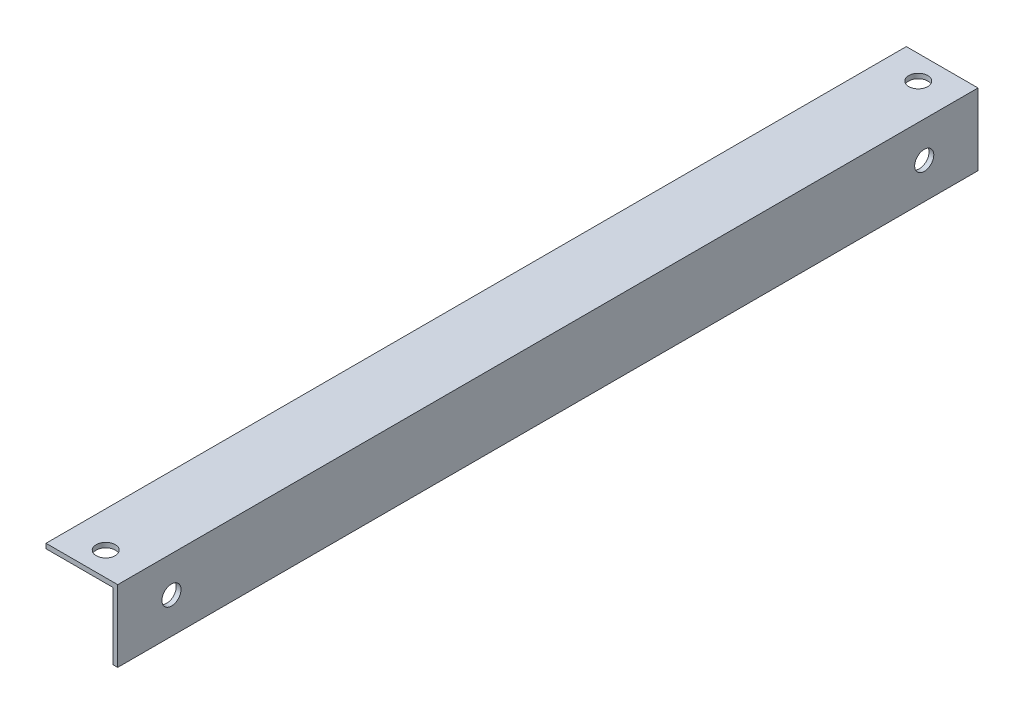
ISO-10303-21;
HEADER;
FILE_DESCRIPTION(('STEP AP214'),'2;1');
FILE_NAME('part.step','',(''),(''),'','','');
FILE_SCHEMA(('AUTOMOTIVE_DESIGN { 1 0 10303 214 1 1 1 1 }'));
ENDSEC;
DATA;
#1=APPLICATION_CONTEXT('core data for automotive mechanical design processes');
#2=APPLICATION_PROTOCOL_DEFINITION('international standard','automotive_design',2000,#1);
#3=PRODUCT_CONTEXT('',#1,'mechanical');
#4=PRODUCT('Part','Part','',(#3));
#5=PRODUCT_RELATED_PRODUCT_CATEGORY('part','',(#4));
#6=PRODUCT_DEFINITION_FORMATION('','',#4);
#7=PRODUCT_DEFINITION_CONTEXT('part definition',#1,'design');
#8=PRODUCT_DEFINITION('design','',#6,#7);
#9=PRODUCT_DEFINITION_SHAPE('','',#8);
#10=(LENGTH_UNIT() NAMED_UNIT(*) SI_UNIT(.MILLI.,.METRE.));
#11=(NAMED_UNIT(*) PLANE_ANGLE_UNIT() SI_UNIT($,.RADIAN.));
#12=(NAMED_UNIT(*) SI_UNIT($,.STERADIAN.) SOLID_ANGLE_UNIT());
#13=UNCERTAINTY_MEASURE_WITH_UNIT(LENGTH_MEASURE(1.E-05),#10,'distance_accuracy_value','');
#14=(GEOMETRIC_REPRESENTATION_CONTEXT(3) GLOBAL_UNCERTAINTY_ASSIGNED_CONTEXT((#13)) GLOBAL_UNIT_ASSIGNED_CONTEXT((#10,
#11,#12)) REPRESENTATION_CONTEXT('',''));
#15=CARTESIAN_POINT('',(0.,0.,0.));
#16=DIRECTION('',(0.,0.,1.));
#17=DIRECTION('',(1.,0.,0.));
#18=AXIS2_PLACEMENT_3D('',#15,#16,#17);
#19=CARTESIAN_POINT('',(0.,0.,180.));
#20=DIRECTION('',(-1.,0.,0.));
#21=DIRECTION('',(0.,-1.,0.));
#22=AXIS2_PLACEMENT_3D('',#19,#20,#21);
#23=PLANE('',#22);
#24=DIRECTION('',(0.,1.,0.));
#25=VECTOR('',#24,1.);
#26=CARTESIAN_POINT('',(0.,0.,-180.));
#27=LINE('',#26,#25);
#28=CARTESIAN_POINT('',(0.,-30.,-180.));
#29=VERTEX_POINT('',#28);
#30=CARTESIAN_POINT('',(0.,0.,-180.));
#31=VERTEX_POINT('',#30);
#32=EDGE_CURVE('E121',#29,#31,#27,.T.);
#33=ORIENTED_EDGE('',*,*,#32,.T.);
#34=DIRECTION('',(0.,0.,-1.));
#35=VECTOR('',#34,1.);
#36=CARTESIAN_POINT('',(0.,0.,180.));
#37=LINE('',#36,#35);
#38=CARTESIAN_POINT('',(0.,0.,180.));
#39=VERTEX_POINT('',#38);
#40=EDGE_CURVE('E11',#39,#31,#37,.T.);
#41=ORIENTED_EDGE('',*,*,#40,.F.);
#42=DIRECTION('',(0.,1.,0.));
#43=VECTOR('',#42,1.);
#44=CARTESIAN_POINT('',(0.,0.,180.));
#45=LINE('',#44,#43);
#46=CARTESIAN_POINT('',(0.,-30.,180.));
#47=VERTEX_POINT('',#46);
#48=EDGE_CURVE('E132',#47,#39,#45,.T.);
#49=ORIENTED_EDGE('',*,*,#48,.F.);
#50=DIRECTION('',(0.,0.,-1.));
#51=VECTOR('',#50,1.);
#52=CARTESIAN_POINT('',(0.,-30.,180.));
#53=LINE('',#52,#51);
#54=EDGE_CURVE('E117',#47,#29,#53,.T.);
#55=ORIENTED_EDGE('',*,*,#54,.T.);
#56=EDGE_LOOP('',(#33,#41,#49,#55));
#57=FACE_BOUND('',#56,.T.);
#58=CARTESIAN_POINT('',(0.,-15.,-157.5));
#59=DIRECTION('',(1.,0.,0.));
#60=DIRECTION('',(0.,1.,0.));
#61=AXIS2_PLACEMENT_3D('',#58,#59,#60);
#62=CIRCLE('',#61,3.99999999999999);
#63=CARTESIAN_POINT('',(0.,-11.,-157.5));
#64=VERTEX_POINT('',#63);
#65=EDGE_CURVE('E265',#64,#64,#62,.T.);
#66=ORIENTED_EDGE('',*,*,#65,.F.);
#67=EDGE_LOOP('',(#66));
#68=FACE_BOUND('',#67,.T.);
#69=CARTESIAN_POINT('',(0.,-15.,157.5));
#70=DIRECTION('',(-1.,0.,0.));
#71=DIRECTION('',(0.,1.,0.));
#72=AXIS2_PLACEMENT_3D('',#69,#70,#71);
#73=CIRCLE('',#72,3.99999999999999);
#74=CARTESIAN_POINT('',(0.,-11.,157.5));
#75=VERTEX_POINT('',#74);
#76=EDGE_CURVE('E253',#75,#75,#73,.T.);
#77=ORIENTED_EDGE('',*,*,#76,.T.);
#78=EDGE_LOOP('',(#77));
#79=FACE_BOUND('',#78,.T.);
#80=ADVANCED_FACE('F35',(#57,#68,#79),#23,.F.);
#81=CARTESIAN_POINT('',(-2.,-2.,180.));
#82=DIRECTION('',(1.,0.,0.));
#83=DIRECTION('',(0.,0.,-1.));
#84=AXIS2_PLACEMENT_3D('',#81,#82,#83);
#85=PLANE('',#84);
#86=DIRECTION('',(0.,-1.,0.));
#87=VECTOR('',#86,1.);
#88=CARTESIAN_POINT('',(-2.,-2.,-180.));
#89=LINE('',#88,#87);
#90=CARTESIAN_POINT('',(-2.,-2.,-180.));
#91=VERTEX_POINT('',#90);
#92=CARTESIAN_POINT('',(-2.,-30.,-180.));
#93=VERTEX_POINT('',#92);
#94=EDGE_CURVE('E74',#91,#93,#89,.T.);
#95=ORIENTED_EDGE('',*,*,#94,.T.);
#96=DIRECTION('',(0.,0.,-1.));
#97=VECTOR('',#96,1.);
#98=CARTESIAN_POINT('',(-2.,-30.,180.));
#99=LINE('',#98,#97);
#100=CARTESIAN_POINT('',(-2.,-30.,180.));
#101=VERTEX_POINT('',#100);
#102=EDGE_CURVE('E112',#101,#93,#99,.T.);
#103=ORIENTED_EDGE('',*,*,#102,.F.);
#104=DIRECTION('',(0.,-1.,0.));
#105=VECTOR('',#104,1.);
#106=CARTESIAN_POINT('',(-2.,-2.,180.));
#107=LINE('',#106,#105);
#108=CARTESIAN_POINT('',(-2.,-2.,180.));
#109=VERTEX_POINT('',#108);
#110=EDGE_CURVE('E99',#109,#101,#107,.T.);
#111=ORIENTED_EDGE('',*,*,#110,.F.);
#112=DIRECTION('',(0.,0.,-1.));
#113=VECTOR('',#112,1.);
#114=CARTESIAN_POINT('',(-2.,-2.,180.));
#115=LINE('',#114,#113);
#116=EDGE_CURVE('E106',#109,#91,#115,.T.);
#117=ORIENTED_EDGE('',*,*,#116,.T.);
#118=EDGE_LOOP('',(#95,#103,#111,#117));
#119=FACE_BOUND('',#118,.T.);
#120=CARTESIAN_POINT('',(-2.,-15.,-157.5));
#121=DIRECTION('',(1.,0.,0.));
#122=DIRECTION('',(0.,0.,-1.));
#123=AXIS2_PLACEMENT_3D('',#120,#121,#122);
#124=CIRCLE('',#123,3.99999999999999);
#125=CARTESIAN_POINT('',(-2.00000000000001,-11.,-157.5));
#126=VERTEX_POINT('',#125);
#127=EDGE_CURVE('E270',#126,#126,#124,.F.);
#128=ORIENTED_EDGE('',*,*,#127,.F.);
#129=EDGE_LOOP('',(#128));
#130=FACE_BOUND('',#129,.T.);
#131=CARTESIAN_POINT('',(-2.,-15.,157.5));
#132=DIRECTION('',(1.,0.,0.));
#133=DIRECTION('',(0.,0.,-1.));
#134=AXIS2_PLACEMENT_3D('',#131,#132,#133);
#135=CIRCLE('',#134,3.99999999999999);
#136=CARTESIAN_POINT('',(-2.00000000000001,-11.,157.5));
#137=VERTEX_POINT('',#136);
#138=EDGE_CURVE('E256',#137,#137,#135,.T.);
#139=ORIENTED_EDGE('',*,*,#138,.T.);
#140=EDGE_LOOP('',(#139));
#141=FACE_BOUND('',#140,.T.);
#142=ADVANCED_FACE('F114',(#119,#130,#141),#85,.F.);
#143=CARTESIAN_POINT('',(0.,0.,180.));
#144=DIRECTION('',(0.,-1.,0.));
#145=DIRECTION('',(1.,0.,0.));
#146=AXIS2_PLACEMENT_3D('',#143,#144,#145);
#147=PLANE('',#146);
#148=DIRECTION('',(-1.,0.,0.));
#149=VECTOR('',#148,1.);
#150=CARTESIAN_POINT('',(0.,0.,-180.));
#151=LINE('',#150,#149);
#152=CARTESIAN_POINT('',(-30.,0.,-180.));
#153=VERTEX_POINT('',#152);
#154=EDGE_CURVE('E124',#31,#153,#151,.T.);
#155=ORIENTED_EDGE('',*,*,#154,.T.);
#156=DIRECTION('',(0.,0.,-1.));
#157=VECTOR('',#156,1.);
#158=CARTESIAN_POINT('',(-30.,0.,180.));
#159=LINE('',#158,#157);
#160=CARTESIAN_POINT('',(-30.,0.,180.));
#161=VERTEX_POINT('',#160);
#162=EDGE_CURVE('E43',#161,#153,#159,.T.);
#163=ORIENTED_EDGE('',*,*,#162,.F.);
#164=DIRECTION('',(-1.,0.,0.));
#165=VECTOR('',#164,1.);
#166=CARTESIAN_POINT('',(0.,0.,180.));
#167=LINE('',#166,#165);
#168=EDGE_CURVE('E88',#39,#161,#167,.T.);
#169=ORIENTED_EDGE('',*,*,#168,.F.);
#170=ORIENTED_EDGE('',*,*,#40,.T.);
#171=EDGE_LOOP('',(#155,#163,#169,#170));
#172=FACE_BOUND('',#171,.T.);
#173=CARTESIAN_POINT('',(-15.,0.,-170.));
#174=DIRECTION('',(0.,1.,0.));
#175=DIRECTION('',(-1.,0.,0.));
#176=AXIS2_PLACEMENT_3D('',#173,#174,#175);
#177=CIRCLE('',#176,4.00000000000001);
#178=CARTESIAN_POINT('',(-19.,0.,-170.));
#179=VERTEX_POINT('',#178);
#180=EDGE_CURVE('E273',#179,#179,#177,.T.);
#181=ORIENTED_EDGE('',*,*,#180,.F.);
#182=EDGE_LOOP('',(#181));
#183=FACE_BOUND('',#182,.T.);
#184=CARTESIAN_POINT('',(-15.,0.,170.));
#185=DIRECTION('',(0.,-1.,0.));
#186=DIRECTION('',(-1.,0.,0.));
#187=AXIS2_PLACEMENT_3D('',#184,#185,#186);
#188=CIRCLE('',#187,4.00000000000001);
#189=CARTESIAN_POINT('',(-19.,0.,170.));
#190=VERTEX_POINT('',#189);
#191=EDGE_CURVE('E262',#190,#190,#188,.T.);
#192=ORIENTED_EDGE('',*,*,#191,.T.);
#193=EDGE_LOOP('',(#192));
#194=FACE_BOUND('',#193,.T.);
#195=ADVANCED_FACE('F161',(#172,#183,#194),#147,.F.);
#196=CARTESIAN_POINT('',(-2.,-2.,180.));
#197=DIRECTION('',(0.,1.,0.));
#198=DIRECTION('',(0.,0.,1.));
#199=AXIS2_PLACEMENT_3D('',#196,#197,#198);
#200=PLANE('',#199);
#201=DIRECTION('',(1.,0.,0.));
#202=VECTOR('',#201,1.);
#203=CARTESIAN_POINT('',(-2.,-2.,-180.));
#204=LINE('',#203,#202);
#205=CARTESIAN_POINT('',(-30.,-2.,-180.));
#206=VERTEX_POINT('',#205);
#207=EDGE_CURVE('E110',#206,#91,#204,.T.);
#208=ORIENTED_EDGE('',*,*,#207,.T.);
#209=ORIENTED_EDGE('',*,*,#116,.F.);
#210=DIRECTION('',(1.,0.,0.));
#211=VECTOR('',#210,1.);
#212=CARTESIAN_POINT('',(-2.,-2.,180.));
#213=LINE('',#212,#211);
#214=CARTESIAN_POINT('',(-30.,-2.,180.));
#215=VERTEX_POINT('',#214);
#216=EDGE_CURVE('E95',#215,#109,#213,.T.);
#217=ORIENTED_EDGE('',*,*,#216,.F.);
#218=DIRECTION('',(0.,0.,-1.));
#219=VECTOR('',#218,1.);
#220=CARTESIAN_POINT('',(-30.,-2.,180.));
#221=LINE('',#220,#219);
#222=EDGE_CURVE('E111',#215,#206,#221,.T.);
#223=ORIENTED_EDGE('',*,*,#222,.T.);
#224=EDGE_LOOP('',(#208,#209,#217,#223));
#225=FACE_BOUND('',#224,.T.);
#226=CARTESIAN_POINT('',(-15.,-2.,-170.));
#227=DIRECTION('',(0.,1.,0.));
#228=DIRECTION('',(0.,0.,1.));
#229=AXIS2_PLACEMENT_3D('',#226,#227,#228);
#230=CIRCLE('',#229,4.00000000000001);
#231=CARTESIAN_POINT('',(-15.,-2.,-166.));
#232=VERTEX_POINT('',#231);
#233=EDGE_CURVE('E125',#232,#232,#230,.F.);
#234=ORIENTED_EDGE('',*,*,#233,.F.);
#235=EDGE_LOOP('',(#234));
#236=FACE_BOUND('',#235,.T.);
#237=CARTESIAN_POINT('',(-15.,-2.,170.));
#238=DIRECTION('',(0.,1.,0.));
#239=DIRECTION('',(0.,0.,1.));
#240=AXIS2_PLACEMENT_3D('',#237,#238,#239);
#241=CIRCLE('',#240,4.00000000000001);
#242=CARTESIAN_POINT('',(-15.,-2.,174.));
#243=VERTEX_POINT('',#242);
#244=EDGE_CURVE('E259',#243,#243,#241,.T.);
#245=ORIENTED_EDGE('',*,*,#244,.T.);
#246=EDGE_LOOP('',(#245));
#247=FACE_BOUND('',#246,.T.);
#248=ADVANCED_FACE('F107',(#225,#236,#247),#200,.F.);
#249=CARTESIAN_POINT('',(-30.,0.,180.));
#250=DIRECTION('',(1.,0.,0.));
#251=DIRECTION('',(0.,0.,-1.));
#252=AXIS2_PLACEMENT_3D('',#249,#250,#251);
#253=PLANE('',#252);
#254=DIRECTION('',(0.,-1.,0.));
#255=VECTOR('',#254,1.);
#256=CARTESIAN_POINT('',(-30.,0.,-180.));
#257=LINE('',#256,#255);
#258=EDGE_CURVE('E127',#153,#206,#257,.T.);
#259=ORIENTED_EDGE('',*,*,#258,.T.);
#260=ORIENTED_EDGE('',*,*,#222,.F.);
#261=DIRECTION('',(0.,-1.,0.));
#262=VECTOR('',#261,1.);
#263=CARTESIAN_POINT('',(-30.,0.,180.));
#264=LINE('',#263,#262);
#265=EDGE_CURVE('E101',#161,#215,#264,.T.);
#266=ORIENTED_EDGE('',*,*,#265,.F.);
#267=ORIENTED_EDGE('',*,*,#162,.T.);
#268=EDGE_LOOP('',(#259,#260,#266,#267));
#269=FACE_BOUND('',#268,.T.);
#270=ADVANCED_FACE('F138',(#269),#253,.F.);
#271=CARTESIAN_POINT('',(-2.,-30.,180.));
#272=DIRECTION('',(0.,1.,0.));
#273=DIRECTION('',(0.,0.,1.));
#274=AXIS2_PLACEMENT_3D('',#271,#272,#273);
#275=PLANE('',#274);
#276=DIRECTION('',(1.,0.,0.));
#277=VECTOR('',#276,1.);
#278=CARTESIAN_POINT('',(-2.,-30.,-180.));
#279=LINE('',#278,#277);
#280=EDGE_CURVE('E80',#93,#29,#279,.T.);
#281=ORIENTED_EDGE('',*,*,#280,.T.);
#282=ORIENTED_EDGE('',*,*,#54,.F.);
#283=DIRECTION('',(1.,0.,0.));
#284=VECTOR('',#283,1.);
#285=CARTESIAN_POINT('',(-2.,-30.,180.));
#286=LINE('',#285,#284);
#287=EDGE_CURVE('E51',#101,#47,#286,.T.);
#288=ORIENTED_EDGE('',*,*,#287,.F.);
#289=ORIENTED_EDGE('',*,*,#102,.T.);
#290=EDGE_LOOP('',(#281,#282,#288,#289));
#291=FACE_BOUND('',#290,.T.);
#292=ADVANCED_FACE('F146',(#291),#275,.F.);
#293=CARTESIAN_POINT('',(0.,0.,180.));
#294=DIRECTION('',(0.,0.,1.));
#295=DIRECTION('',(1.,0.,0.));
#296=AXIS2_PLACEMENT_3D('',#293,#294,#295);
#297=PLANE('',#296);
#298=ORIENTED_EDGE('',*,*,#48,.T.);
#299=ORIENTED_EDGE('',*,*,#168,.T.);
#300=ORIENTED_EDGE('',*,*,#265,.T.);
#301=ORIENTED_EDGE('',*,*,#216,.T.);
#302=ORIENTED_EDGE('',*,*,#110,.T.);
#303=ORIENTED_EDGE('',*,*,#287,.T.);
#304=EDGE_LOOP('',(#298,#299,#300,#301,#302,#303));
#305=FACE_BOUND('',#304,.T.);
#306=ADVANCED_FACE('F97',(#305),#297,.T.);
#307=CARTESIAN_POINT('',(0.,0.,-180.));
#308=DIRECTION('',(0.,0.,1.));
#309=DIRECTION('',(1.,0.,0.));
#310=AXIS2_PLACEMENT_3D('',#307,#308,#309);
#311=PLANE('',#310);
#312=ORIENTED_EDGE('',*,*,#32,.F.);
#313=ORIENTED_EDGE('',*,*,#280,.F.);
#314=ORIENTED_EDGE('',*,*,#94,.F.);
#315=ORIENTED_EDGE('',*,*,#207,.F.);
#316=ORIENTED_EDGE('',*,*,#258,.F.);
#317=ORIENTED_EDGE('',*,*,#154,.F.);
#318=EDGE_LOOP('',(#312,#313,#314,#315,#316,#317));
#319=FACE_BOUND('',#318,.T.);
#320=ADVANCED_FACE('F141',(#319),#311,.F.);
#321=CARTESIAN_POINT('',(-15.,-30.001,-170.));
#322=DIRECTION('',(0.,1.,0.));
#323=DIRECTION('',(-1.,0.,0.));
#324=AXIS2_PLACEMENT_3D('',#321,#322,#323);
#325=CYLINDRICAL_SURFACE('',#324,4.00000000000001);
#326=ORIENTED_EDGE('',*,*,#180,.T.);
#327=EDGE_LOOP('',(#326));
#328=FACE_BOUND('',#327,.T.);
#329=ORIENTED_EDGE('',*,*,#233,.T.);
#330=EDGE_LOOP('',(#329));
#331=FACE_BOUND('',#330,.T.);
#332=ADVANCED_FACE('F195',(#328,#331),#325,.F.);
#333=CARTESIAN_POINT('',(-30.001,-15.,-157.5));
#334=DIRECTION('',(1.,0.,0.));
#335=DIRECTION('',(0.,1.,0.));
#336=AXIS2_PLACEMENT_3D('',#333,#334,#335);
#337=CYLINDRICAL_SURFACE('',#336,3.99999999999999);
#338=CARTESIAN_POINT('',(0.,-11.,-157.5));
#339=CARTESIAN_POINT('',(-0.0208333333333299,-11.,-157.5));
#340=CARTESIAN_POINT('',(-0.0416666666666632,-11.,-157.5));
#341=CARTESIAN_POINT('',(-0.08333333333333,-11.,-157.5));
#342=CARTESIAN_POINT('',(-0.104166666666663,-11.,-157.5));
#343=CARTESIAN_POINT('',(-0.14583333333333,-11.,-157.5));
#344=CARTESIAN_POINT('',(-0.166666666666663,-11.,-157.5));
#345=CARTESIAN_POINT('',(-0.20833333333333,-11.,-157.5));
#346=CARTESIAN_POINT('',(-0.229166666666663,-11.,-157.5));
#347=CARTESIAN_POINT('',(-0.27083333333333,-11.,-157.5));
#348=CARTESIAN_POINT('',(-0.291666666666663,-11.,-157.5));
#349=CARTESIAN_POINT('',(-0.33333333333333,-11.,-157.5));
#350=CARTESIAN_POINT('',(-0.354166666666664,-11.,-157.5));
#351=CARTESIAN_POINT('',(-0.39583333333333,-11.,-157.5));
#352=CARTESIAN_POINT('',(-0.416666666666664,-11.,-157.5));
#353=CARTESIAN_POINT('',(-0.45833333333333,-11.,-157.5));
#354=CARTESIAN_POINT('',(-0.479166666666664,-11.,-157.5));
#355=CARTESIAN_POINT('',(-0.520833333333331,-11.,-157.5));
#356=CARTESIAN_POINT('',(-0.541666666666666,-11.,-157.5));
#357=CARTESIAN_POINT('',(-0.583333333333334,-11.,-157.5));
#358=CARTESIAN_POINT('',(-0.604166666666667,-11.,-157.5));
#359=CARTESIAN_POINT('',(-0.645833333333334,-11.,-157.5));
#360=CARTESIAN_POINT('',(-0.666666666666667,-11.,-157.5));
#361=CARTESIAN_POINT('',(-0.708333333333334,-11.,-157.5));
#362=CARTESIAN_POINT('',(-0.729166666666667,-11.,-157.5));
#363=CARTESIAN_POINT('',(-0.770833333333334,-11.,-157.5));
#364=CARTESIAN_POINT('',(-0.791666666666667,-11.,-157.5));
#365=CARTESIAN_POINT('',(-0.833333333333334,-11.,-157.5));
#366=CARTESIAN_POINT('',(-0.854166666666667,-11.,-157.5));
#367=CARTESIAN_POINT('',(-0.895833333333334,-11.,-157.5));
#368=CARTESIAN_POINT('',(-0.916666666666668,-11.,-157.5));
#369=CARTESIAN_POINT('',(-0.958333333333334,-11.,-157.5));
#370=CARTESIAN_POINT('',(-0.979166666666668,-11.,-157.5));
#371=CARTESIAN_POINT('',(-1.02083333333333,-11.,-157.5));
#372=CARTESIAN_POINT('',(-1.04166666666667,-11.,-157.5));
#373=CARTESIAN_POINT('',(-1.08333333333333,-11.,-157.5));
#374=CARTESIAN_POINT('',(-1.10416666666667,-11.,-157.5));
#375=CARTESIAN_POINT('',(-1.14583333333333,-11.,-157.5));
#376=CARTESIAN_POINT('',(-1.16666666666667,-11.,-157.5));
#377=CARTESIAN_POINT('',(-1.20833333333333,-11.,-157.5));
#378=CARTESIAN_POINT('',(-1.22916666666667,-11.,-157.5));
#379=CARTESIAN_POINT('',(-1.27083333333333,-11.,-157.5));
#380=CARTESIAN_POINT('',(-1.29166666666667,-11.,-157.5));
#381=CARTESIAN_POINT('',(-1.33333333333333,-11.,-157.5));
#382=CARTESIAN_POINT('',(-1.35416666666667,-11.,-157.5));
#383=CARTESIAN_POINT('',(-1.39583333333333,-11.,-157.5));
#384=CARTESIAN_POINT('',(-1.41666666666667,-11.,-157.5));
#385=CARTESIAN_POINT('',(-1.45833333333334,-11.,-157.5));
#386=CARTESIAN_POINT('',(-1.47916666666667,-11.,-157.5));
#387=CARTESIAN_POINT('',(-1.52083333333334,-11.,-157.5));
#388=CARTESIAN_POINT('',(-1.54166666666667,-11.,-157.5));
#389=CARTESIAN_POINT('',(-1.58333333333334,-11.,-157.5));
#390=CARTESIAN_POINT('',(-1.60416666666667,-11.,-157.5));
#391=CARTESIAN_POINT('',(-1.64583333333334,-11.,-157.5));
#392=CARTESIAN_POINT('',(-1.66666666666667,-11.,-157.5));
#393=CARTESIAN_POINT('',(-1.70833333333334,-11.,-157.5));
#394=CARTESIAN_POINT('',(-1.72916666666667,-11.,-157.5));
#395=CARTESIAN_POINT('',(-1.77083333333334,-11.,-157.5));
#396=CARTESIAN_POINT('',(-1.79166666666667,-11.,-157.5));
#397=CARTESIAN_POINT('',(-1.83333333333334,-11.,-157.5));
#398=CARTESIAN_POINT('',(-1.85416666666667,-11.,-157.5));
#399=CARTESIAN_POINT('',(-1.89583333333334,-11.,-157.5));
#400=CARTESIAN_POINT('',(-1.91666666666667,-11.,-157.5));
#401=CARTESIAN_POINT('',(-1.95833333333334,-11.,-157.5));
#402=CARTESIAN_POINT('',(-1.97916666666667,-11.,-157.5));
#403=CARTESIAN_POINT('',(-2.00000000000001,-11.,-157.5));
#404=B_SPLINE_CURVE_WITH_KNOTS('',3,(#338,#339,#340,#341,#342,#343,#344,#345,#346,#347,#348,
#349,#350,#351,#352,#353,#354,#355,#356,#357,#358,#359,#360,#361,#362,#363,#364,#365,#366,#367,
#368,#369,#370,#371,#372,#373,#374,#375,#376,#377,#378,#379,#380,#381,#382,#383,#384,#385,#386,
#387,#388,#389,#390,#391,#392,#393,#394,#395,#396,#397,#398,#399,#400,#401,#402,#403),
.UNSPECIFIED.,.F.,.F.,(4,2,2,2,2,2,2,2,2,2,2,2,2,2,2,2,2,2,2,2,2,2,2,2,2,2,2,2,2,2,2,2,4),(0.,
0.0625000000000001,0.125,0.1875,0.25,0.3125,0.375,0.4375,0.5,0.562500000000004,
0.625000000000004,0.687500000000004,0.750000000000004,0.812500000000004,0.875000000000004,
0.937500000000004,1.,1.0625,1.125,1.1875,1.25,1.3125,1.375,1.4375,1.50000000000001,
1.56250000000001,1.62500000000001,1.68750000000001,1.75000000000001,1.81250000000001,
1.87500000000001,1.93750000000001,2.00000000000001),.UNSPECIFIED.);
#405=EDGE_CURVE('BSEAM203',#64,#126,#404,.T.);
#406=ORIENTED_EDGE('',*,*,#65,.T.);
#407=ORIENTED_EDGE('',*,*,#127,.T.);
#408=ORIENTED_EDGE('',*,*,#405,.T.);
#409=ORIENTED_EDGE('',*,*,#405,.F.);
#410=EDGE_LOOP('',(#406,#408,#407,#409));
#411=FACE_BOUND('',#410,.T.);
#412=ADVANCED_FACE('F203',(#411),#337,.F.);
#413=CARTESIAN_POINT('',(-15.,-30.001,170.));
#414=DIRECTION('',(0.,1.,0.));
#415=DIRECTION('',(-1.,0.,0.));
#416=AXIS2_PLACEMENT_3D('',#413,#414,#415);
#417=CYLINDRICAL_SURFACE('',#416,4.00000000000001);
#418=ORIENTED_EDGE('',*,*,#191,.F.);
#419=EDGE_LOOP('',(#418));
#420=FACE_BOUND('',#419,.T.);
#421=ORIENTED_EDGE('',*,*,#244,.F.);
#422=EDGE_LOOP('',(#421));
#423=FACE_BOUND('',#422,.T.);
#424=ADVANCED_FACE('F212',(#420,#423),#417,.F.);
#425=CARTESIAN_POINT('',(-30.001,-15.,157.5));
#426=DIRECTION('',(1.,0.,0.));
#427=DIRECTION('',(0.,1.,0.));
#428=AXIS2_PLACEMENT_3D('',#425,#426,#427);
#429=CYLINDRICAL_SURFACE('',#428,3.99999999999999);
#430=CARTESIAN_POINT('',(0.,-11.,157.5));
#431=CARTESIAN_POINT('',(-0.0208333333333299,-11.,157.5));
#432=CARTESIAN_POINT('',(-0.0416666666666632,-11.,157.5));
#433=CARTESIAN_POINT('',(-0.08333333333333,-11.,157.5));
#434=CARTESIAN_POINT('',(-0.104166666666663,-11.,157.5));
#435=CARTESIAN_POINT('',(-0.14583333333333,-11.,157.5));
#436=CARTESIAN_POINT('',(-0.166666666666663,-11.,157.5));
#437=CARTESIAN_POINT('',(-0.20833333333333,-11.,157.5));
#438=CARTESIAN_POINT('',(-0.229166666666663,-11.,157.5));
#439=CARTESIAN_POINT('',(-0.27083333333333,-11.,157.5));
#440=CARTESIAN_POINT('',(-0.291666666666663,-11.,157.5));
#441=CARTESIAN_POINT('',(-0.33333333333333,-11.,157.5));
#442=CARTESIAN_POINT('',(-0.354166666666664,-11.,157.5));
#443=CARTESIAN_POINT('',(-0.39583333333333,-11.,157.5));
#444=CARTESIAN_POINT('',(-0.416666666666664,-11.,157.5));
#445=CARTESIAN_POINT('',(-0.45833333333333,-11.,157.5));
#446=CARTESIAN_POINT('',(-0.479166666666664,-11.,157.5));
#447=CARTESIAN_POINT('',(-0.520833333333331,-11.,157.5));
#448=CARTESIAN_POINT('',(-0.541666666666666,-11.,157.5));
#449=CARTESIAN_POINT('',(-0.583333333333334,-11.,157.5));
#450=CARTESIAN_POINT('',(-0.604166666666667,-11.,157.5));
#451=CARTESIAN_POINT('',(-0.645833333333334,-11.,157.5));
#452=CARTESIAN_POINT('',(-0.666666666666667,-11.,157.5));
#453=CARTESIAN_POINT('',(-0.708333333333334,-11.,157.5));
#454=CARTESIAN_POINT('',(-0.729166666666667,-11.,157.5));
#455=CARTESIAN_POINT('',(-0.770833333333334,-11.,157.5));
#456=CARTESIAN_POINT('',(-0.791666666666667,-11.,157.5));
#457=CARTESIAN_POINT('',(-0.833333333333334,-11.,157.5));
#458=CARTESIAN_POINT('',(-0.854166666666667,-11.,157.5));
#459=CARTESIAN_POINT('',(-0.895833333333334,-11.,157.5));
#460=CARTESIAN_POINT('',(-0.916666666666668,-11.,157.5));
#461=CARTESIAN_POINT('',(-0.958333333333334,-11.,157.5));
#462=CARTESIAN_POINT('',(-0.979166666666668,-11.,157.5));
#463=CARTESIAN_POINT('',(-1.02083333333333,-11.,157.5));
#464=CARTESIAN_POINT('',(-1.04166666666667,-11.,157.5));
#465=CARTESIAN_POINT('',(-1.08333333333333,-11.,157.5));
#466=CARTESIAN_POINT('',(-1.10416666666667,-11.,157.5));
#467=CARTESIAN_POINT('',(-1.14583333333333,-11.,157.5));
#468=CARTESIAN_POINT('',(-1.16666666666667,-11.,157.5));
#469=CARTESIAN_POINT('',(-1.20833333333333,-11.,157.5));
#470=CARTESIAN_POINT('',(-1.22916666666667,-11.,157.5));
#471=CARTESIAN_POINT('',(-1.27083333333333,-11.,157.5));
#472=CARTESIAN_POINT('',(-1.29166666666667,-11.,157.5));
#473=CARTESIAN_POINT('',(-1.33333333333333,-11.,157.5));
#474=CARTESIAN_POINT('',(-1.35416666666667,-11.,157.5));
#475=CARTESIAN_POINT('',(-1.39583333333333,-11.,157.5));
#476=CARTESIAN_POINT('',(-1.41666666666667,-11.,157.5));
#477=CARTESIAN_POINT('',(-1.45833333333334,-11.,157.5));
#478=CARTESIAN_POINT('',(-1.47916666666667,-11.,157.5));
#479=CARTESIAN_POINT('',(-1.52083333333334,-11.,157.5));
#480=CARTESIAN_POINT('',(-1.54166666666667,-11.,157.5));
#481=CARTESIAN_POINT('',(-1.58333333333334,-11.,157.5));
#482=CARTESIAN_POINT('',(-1.60416666666667,-11.,157.5));
#483=CARTESIAN_POINT('',(-1.64583333333334,-11.,157.5));
#484=CARTESIAN_POINT('',(-1.66666666666667,-11.,157.5));
#485=CARTESIAN_POINT('',(-1.70833333333334,-11.,157.5));
#486=CARTESIAN_POINT('',(-1.72916666666667,-11.,157.5));
#487=CARTESIAN_POINT('',(-1.77083333333334,-11.,157.5));
#488=CARTESIAN_POINT('',(-1.79166666666667,-11.,157.5));
#489=CARTESIAN_POINT('',(-1.83333333333334,-11.,157.5));
#490=CARTESIAN_POINT('',(-1.85416666666667,-11.,157.5));
#491=CARTESIAN_POINT('',(-1.89583333333334,-11.,157.5));
#492=CARTESIAN_POINT('',(-1.91666666666667,-11.,157.5));
#493=CARTESIAN_POINT('',(-1.95833333333334,-11.,157.5));
#494=CARTESIAN_POINT('',(-1.97916666666667,-11.,157.5));
#495=CARTESIAN_POINT('',(-2.00000000000001,-11.,157.5));
#496=B_SPLINE_CURVE_WITH_KNOTS('',3,(#430,#431,#432,#433,#434,#435,#436,#437,#438,#439,#440,
#441,#442,#443,#444,#445,#446,#447,#448,#449,#450,#451,#452,#453,#454,#455,#456,#457,#458,#459,
#460,#461,#462,#463,#464,#465,#466,#467,#468,#469,#470,#471,#472,#473,#474,#475,#476,#477,#478,
#479,#480,#481,#482,#483,#484,#485,#486,#487,#488,#489,#490,#491,#492,#493,#494,#495),
.UNSPECIFIED.,.F.,.F.,(4,2,2,2,2,2,2,2,2,2,2,2,2,2,2,2,2,2,2,2,2,2,2,2,2,2,2,2,2,2,2,2,4),(0.,
0.0625000000000001,0.125,0.1875,0.25,0.3125,0.375,0.4375,0.5,0.562500000000004,
0.625000000000004,0.687500000000004,0.750000000000004,0.812500000000004,0.875000000000004,
0.937500000000004,1.,1.0625,1.125,1.1875,1.25,1.3125,1.375,1.4375,1.50000000000001,
1.56250000000001,1.62500000000001,1.68750000000001,1.75000000000001,1.81250000000001,
1.87500000000001,1.93750000000001,2.00000000000001),.UNSPECIFIED.);
#497=EDGE_CURVE('BSEAM237',#75,#137,#496,.T.);
#498=ORIENTED_EDGE('',*,*,#76,.F.);
#499=ORIENTED_EDGE('',*,*,#138,.F.);
#500=ORIENTED_EDGE('',*,*,#497,.T.);
#501=ORIENTED_EDGE('',*,*,#497,.F.);
#502=EDGE_LOOP('',(#498,#500,#499,#501));
#503=FACE_BOUND('',#502,.T.);
#504=ADVANCED_FACE('F237',(#503),#429,.F.);
#505=CLOSED_SHELL('',(#80,#142,#195,#248,#270,#292,#306,#320,#332,#412,#424,#504));
#506=MANIFOLD_SOLID_BREP('B2',#505);
#507=ADVANCED_BREP_SHAPE_REPRESENTATION('',(#18,#506),#14);
#508=SHAPE_DEFINITION_REPRESENTATION(#9,#507);
ENDSEC;
END-ISO-10303-21;
